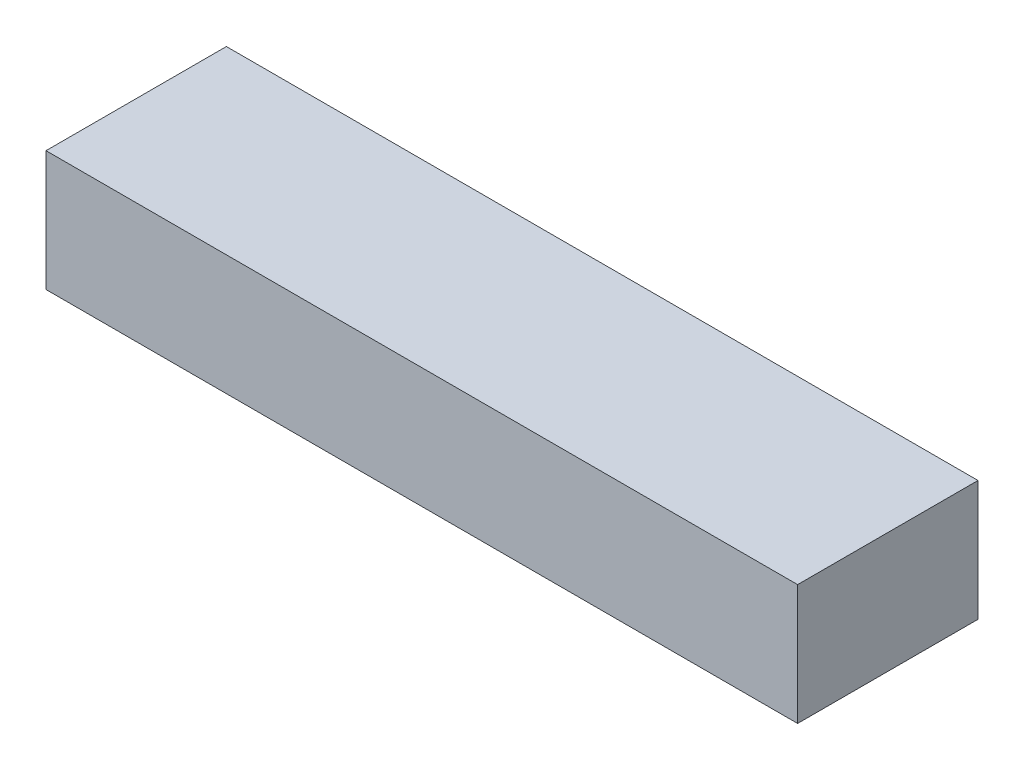
ISO-10303-21;
HEADER;
FILE_DESCRIPTION(('STEP AP214'),'2;1');
FILE_NAME('part.step','',(''),(''),'','','');
FILE_SCHEMA(('AUTOMOTIVE_DESIGN { 1 0 10303 214 1 1 1 1 }'));
ENDSEC;
DATA;
#1=APPLICATION_CONTEXT('core data for automotive mechanical design processes');
#2=APPLICATION_PROTOCOL_DEFINITION('international standard','automotive_design',2000,#1);
#3=PRODUCT_CONTEXT('',#1,'mechanical');
#4=PRODUCT('Part','Part','',(#3));
#5=PRODUCT_RELATED_PRODUCT_CATEGORY('part','',(#4));
#6=PRODUCT_DEFINITION_FORMATION('','',#4);
#7=PRODUCT_DEFINITION_CONTEXT('part definition',#1,'design');
#8=PRODUCT_DEFINITION('design','',#6,#7);
#9=PRODUCT_DEFINITION_SHAPE('','',#8);
#10=(LENGTH_UNIT() NAMED_UNIT(*) SI_UNIT(.MILLI.,.METRE.));
#11=(NAMED_UNIT(*) PLANE_ANGLE_UNIT() SI_UNIT($,.RADIAN.));
#12=(NAMED_UNIT(*) SI_UNIT($,.STERADIAN.) SOLID_ANGLE_UNIT());
#13=UNCERTAINTY_MEASURE_WITH_UNIT(LENGTH_MEASURE(1.E-05),#10,'distance_accuracy_value','');
#14=(GEOMETRIC_REPRESENTATION_CONTEXT(3) GLOBAL_UNCERTAINTY_ASSIGNED_CONTEXT((#13)) GLOBAL_UNIT_ASSIGNED_CONTEXT((#10,
#11,#12)) REPRESENTATION_CONTEXT('',''));
#15=CARTESIAN_POINT('',(0.,0.,0.));
#16=DIRECTION('',(0.,0.,1.));
#17=DIRECTION('',(1.,0.,0.));
#18=AXIS2_PLACEMENT_3D('',#15,#16,#17);
#19=CARTESIAN_POINT('',(25.,8.,6.));
#20=DIRECTION('',(-1.,0.,0.));
#21=DIRECTION('',(0.,0.,1.));
#22=AXIS2_PLACEMENT_3D('',#19,#20,#21);
#23=PLANE('',#22);
#24=DIRECTION('',(0.,0.,-1.));
#25=VECTOR('',#24,1.);
#26=CARTESIAN_POINT('',(25.,0.,6.));
#27=LINE('',#26,#25);
#28=CARTESIAN_POINT('',(25.,0.,6.));
#29=VERTEX_POINT('',#28);
#30=CARTESIAN_POINT('',(25.,0.,-6.));
#31=VERTEX_POINT('',#30);
#32=EDGE_CURVE('E96',#29,#31,#27,.T.);
#33=ORIENTED_EDGE('',*,*,#32,.T.);
#34=DIRECTION('',(0.,-1.,0.));
#35=VECTOR('',#34,1.);
#36=CARTESIAN_POINT('',(25.,8.,-6.));
#37=LINE('',#36,#35);
#38=CARTESIAN_POINT('',(25.,8.,-6.));
#39=VERTEX_POINT('',#38);
#40=EDGE_CURVE('E11',#39,#31,#37,.T.);
#41=ORIENTED_EDGE('',*,*,#40,.F.);
#42=DIRECTION('',(0.,0.,-1.));
#43=VECTOR('',#42,1.);
#44=CARTESIAN_POINT('',(25.,8.,6.));
#45=LINE('',#44,#43);
#46=CARTESIAN_POINT('',(25.,8.,6.));
#47=VERTEX_POINT('',#46);
#48=EDGE_CURVE('E84',#47,#39,#45,.T.);
#49=ORIENTED_EDGE('',*,*,#48,.F.);
#50=DIRECTION('',(0.,-1.,0.));
#51=VECTOR('',#50,1.);
#52=CARTESIAN_POINT('',(25.,8.,6.));
#53=LINE('',#52,#51);
#54=EDGE_CURVE('E92',#47,#29,#53,.T.);
#55=ORIENTED_EDGE('',*,*,#54,.T.);
#56=EDGE_LOOP('',(#33,#41,#49,#55));
#57=FACE_BOUND('',#56,.T.);
#58=ADVANCED_FACE('F33',(#57),#23,.F.);
#59=CARTESIAN_POINT('',(-25.,8.,-6.));
#60=DIRECTION('',(0.,0.,1.));
#61=DIRECTION('',(1.,0.,0.));
#62=AXIS2_PLACEMENT_3D('',#59,#60,#61);
#63=PLANE('',#62);
#64=DIRECTION('',(-1.,0.,0.));
#65=VECTOR('',#64,1.);
#66=CARTESIAN_POINT('',(-25.,0.,-6.));
#67=LINE('',#66,#65);
#68=CARTESIAN_POINT('',(-25.,0.,-6.));
#69=VERTEX_POINT('',#68);
#70=EDGE_CURVE('E88',#31,#69,#67,.T.);
#71=ORIENTED_EDGE('',*,*,#70,.T.);
#72=DIRECTION('',(0.,-1.,0.));
#73=VECTOR('',#72,1.);
#74=CARTESIAN_POINT('',(-25.,8.,-6.));
#75=LINE('',#74,#73);
#76=CARTESIAN_POINT('',(-25.,8.,-6.));
#77=VERTEX_POINT('',#76);
#78=EDGE_CURVE('E41',#77,#69,#75,.T.);
#79=ORIENTED_EDGE('',*,*,#78,.F.);
#80=DIRECTION('',(-1.,0.,0.));
#81=VECTOR('',#80,1.);
#82=CARTESIAN_POINT('',(-25.,8.,-6.));
#83=LINE('',#82,#81);
#84=EDGE_CURVE('E79',#39,#77,#83,.T.);
#85=ORIENTED_EDGE('',*,*,#84,.F.);
#86=ORIENTED_EDGE('',*,*,#40,.T.);
#87=EDGE_LOOP('',(#71,#79,#85,#86));
#88=FACE_BOUND('',#87,.T.);
#89=ADVANCED_FACE('F87',(#88),#63,.F.);
#90=CARTESIAN_POINT('',(-25.,8.,6.));
#91=DIRECTION('',(1.,0.,0.));
#92=DIRECTION('',(0.,0.,-1.));
#93=AXIS2_PLACEMENT_3D('',#90,#91,#92);
#94=PLANE('',#93);
#95=DIRECTION('',(0.,0.,1.));
#96=VECTOR('',#95,1.);
#97=CARTESIAN_POINT('',(-25.,0.,6.));
#98=LINE('',#97,#96);
#99=CARTESIAN_POINT('',(-25.,0.,6.));
#100=VERTEX_POINT('',#99);
#101=EDGE_CURVE('E66',#69,#100,#98,.T.);
#102=ORIENTED_EDGE('',*,*,#101,.T.);
#103=DIRECTION('',(0.,-1.,0.));
#104=VECTOR('',#103,1.);
#105=CARTESIAN_POINT('',(-25.,8.,6.));
#106=LINE('',#105,#104);
#107=CARTESIAN_POINT('',(-25.,8.,6.));
#108=VERTEX_POINT('',#107);
#109=EDGE_CURVE('E89',#108,#100,#106,.T.);
#110=ORIENTED_EDGE('',*,*,#109,.F.);
#111=DIRECTION('',(0.,0.,1.));
#112=VECTOR('',#111,1.);
#113=CARTESIAN_POINT('',(-25.,8.,6.));
#114=LINE('',#113,#112);
#115=EDGE_CURVE('E82',#77,#108,#114,.T.);
#116=ORIENTED_EDGE('',*,*,#115,.F.);
#117=ORIENTED_EDGE('',*,*,#78,.T.);
#118=EDGE_LOOP('',(#102,#110,#116,#117));
#119=FACE_BOUND('',#118,.T.);
#120=ADVANCED_FACE('F90',(#119),#94,.F.);
#121=CARTESIAN_POINT('',(-25.,8.,6.));
#122=DIRECTION('',(0.,0.,-1.));
#123=DIRECTION('',(-1.,0.,0.));
#124=AXIS2_PLACEMENT_3D('',#121,#122,#123);
#125=PLANE('',#124);
#126=DIRECTION('',(1.,0.,0.));
#127=VECTOR('',#126,1.);
#128=CARTESIAN_POINT('',(-25.,0.,6.));
#129=LINE('',#128,#127);
#130=EDGE_CURVE('E72',#100,#29,#129,.T.);
#131=ORIENTED_EDGE('',*,*,#130,.T.);
#132=ORIENTED_EDGE('',*,*,#54,.F.);
#133=DIRECTION('',(1.,0.,0.));
#134=VECTOR('',#133,1.);
#135=CARTESIAN_POINT('',(-25.,8.,6.));
#136=LINE('',#135,#134);
#137=EDGE_CURVE('E49',#108,#47,#136,.T.);
#138=ORIENTED_EDGE('',*,*,#137,.F.);
#139=ORIENTED_EDGE('',*,*,#109,.T.);
#140=EDGE_LOOP('',(#131,#132,#138,#139));
#141=FACE_BOUND('',#140,.T.);
#142=ADVANCED_FACE('F103',(#141),#125,.F.);
#143=CARTESIAN_POINT('',(0.,8.,0.));
#144=DIRECTION('',(0.,-1.,0.));
#145=DIRECTION('',(0.,0.,-1.));
#146=AXIS2_PLACEMENT_3D('',#143,#144,#145);
#147=PLANE('',#146);
#148=ORIENTED_EDGE('',*,*,#48,.T.);
#149=ORIENTED_EDGE('',*,*,#84,.T.);
#150=ORIENTED_EDGE('',*,*,#115,.T.);
#151=ORIENTED_EDGE('',*,*,#137,.T.);
#152=EDGE_LOOP('',(#148,#149,#150,#151));
#153=FACE_BOUND('',#152,.T.);
#154=ADVANCED_FACE('F80',(#153),#147,.F.);
#155=CARTESIAN_POINT('',(0.,0.,0.));
#156=DIRECTION('',(0.,-1.,0.));
#157=DIRECTION('',(0.,0.,-1.));
#158=AXIS2_PLACEMENT_3D('',#155,#156,#157);
#159=PLANE('',#158);
#160=ORIENTED_EDGE('',*,*,#32,.F.);
#161=ORIENTED_EDGE('',*,*,#130,.F.);
#162=ORIENTED_EDGE('',*,*,#101,.F.);
#163=ORIENTED_EDGE('',*,*,#70,.F.);
#164=EDGE_LOOP('',(#160,#161,#162,#163));
#165=FACE_BOUND('',#164,.T.);
#166=ADVANCED_FACE('F106',(#165),#159,.T.);
#167=CLOSED_SHELL('',(#58,#89,#120,#142,#154,#166));
#168=MANIFOLD_SOLID_BREP('B2',#167);
#169=ADVANCED_BREP_SHAPE_REPRESENTATION('',(#18,#168),#14);
#170=SHAPE_DEFINITION_REPRESENTATION(#9,#169);
ENDSEC;
END-ISO-10303-21;
